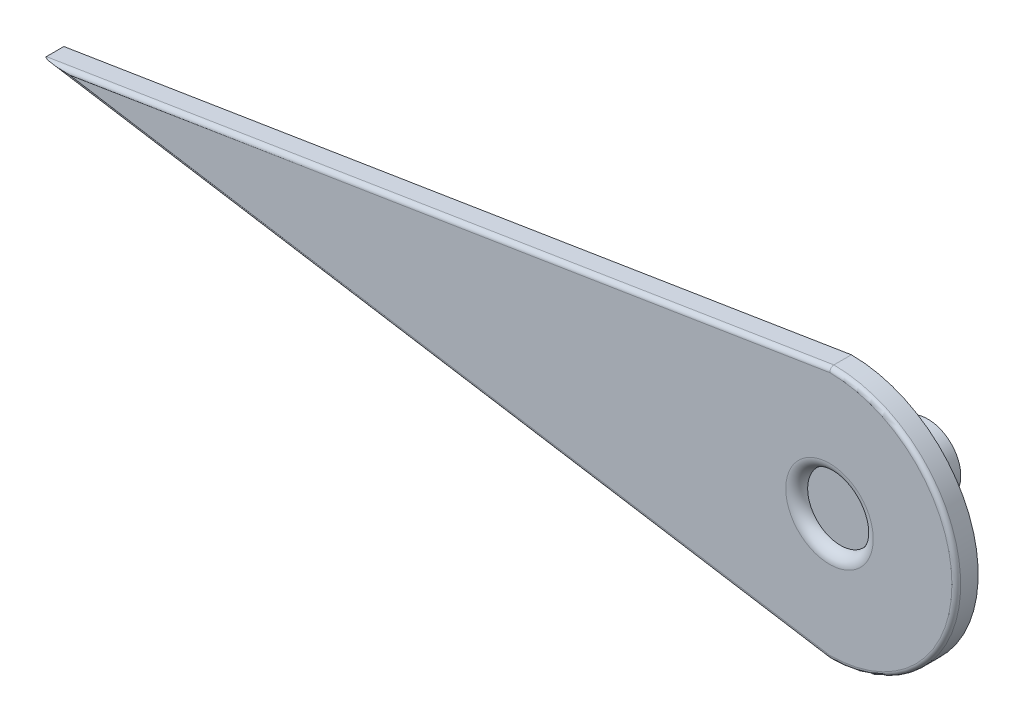
ISO-10303-21;
HEADER;
FILE_DESCRIPTION(('STEP AP214'),'2;1');
FILE_NAME('part.step','',(''),(''),'','','');
FILE_SCHEMA(('AUTOMOTIVE_DESIGN { 1 0 10303 214 1 1 1 1 }'));
ENDSEC;
DATA;
#1=APPLICATION_CONTEXT('core data for automotive mechanical design processes');
#2=APPLICATION_PROTOCOL_DEFINITION('international standard','automotive_design',2000,#1);
#3=PRODUCT_CONTEXT('',#1,'mechanical');
#4=PRODUCT('Part','Part','',(#3));
#5=PRODUCT_RELATED_PRODUCT_CATEGORY('part','',(#4));
#6=PRODUCT_DEFINITION_FORMATION('','',#4);
#7=PRODUCT_DEFINITION_CONTEXT('part definition',#1,'design');
#8=PRODUCT_DEFINITION('design','',#6,#7);
#9=PRODUCT_DEFINITION_SHAPE('','',#8);
#10=(LENGTH_UNIT() NAMED_UNIT(*) SI_UNIT(.MILLI.,.METRE.));
#11=(NAMED_UNIT(*) PLANE_ANGLE_UNIT() SI_UNIT($,.RADIAN.));
#12=(NAMED_UNIT(*) SI_UNIT($,.STERADIAN.) SOLID_ANGLE_UNIT());
#13=UNCERTAINTY_MEASURE_WITH_UNIT(LENGTH_MEASURE(1.E-05),#10,'distance_accuracy_value','');
#14=(GEOMETRIC_REPRESENTATION_CONTEXT(3) GLOBAL_UNCERTAINTY_ASSIGNED_CONTEXT((#13)) GLOBAL_UNIT_ASSIGNED_CONTEXT((#10,
#11,#12)) REPRESENTATION_CONTEXT('',''));
#15=CARTESIAN_POINT('',(0.,0.,0.));
#16=DIRECTION('',(0.,0.,1.));
#17=DIRECTION('',(1.,0.,0.));
#18=AXIS2_PLACEMENT_3D('',#15,#16,#17);
#19=CARTESIAN_POINT('',(3.6,0.,0.05));
#20=DIRECTION('',(0.,0.,-1.));
#21=DIRECTION('',(-1.,0.,0.));
#22=AXIS2_PLACEMENT_3D('',#19,#20,#21);
#23=CYLINDRICAL_SURFACE('',#22,0.15);
#24=CARTESIAN_POINT('',(3.6,0.,0.05));
#25=DIRECTION('',(0.,0.,-1.));
#26=DIRECTION('',(-1.,0.,0.));
#27=AXIS2_PLACEMENT_3D('',#24,#25,#26);
#28=CIRCLE('',#27,0.15);
#29=CARTESIAN_POINT('',(3.45,0.,0.05));
#30=VERTEX_POINT('',#29);
#31=EDGE_CURVE('E11',#30,#30,#28,.T.);
#32=ORIENTED_EDGE('',*,*,#31,.T.);
#33=EDGE_LOOP('',(#32));
#34=FACE_BOUND('',#33,.T.);
#35=CARTESIAN_POINT('',(3.6,0.,-0.35));
#36=DIRECTION('',(0.,0.,-1.));
#37=DIRECTION('',(-1.,0.,0.));
#38=AXIS2_PLACEMENT_3D('',#35,#36,#37);
#39=CIRCLE('',#38,0.15);
#40=CARTESIAN_POINT('',(3.45,0.,-0.35));
#41=VERTEX_POINT('',#40);
#42=EDGE_CURVE('E46',#41,#41,#39,.T.);
#43=ORIENTED_EDGE('',*,*,#42,.F.);
#44=EDGE_LOOP('',(#43));
#45=FACE_BOUND('',#44,.T.);
#46=ADVANCED_FACE('F40',(#34,#45),#23,.T.);
#47=CARTESIAN_POINT('',(3.6,0.,0.05));
#48=DIRECTION('',(0.,0.,-1.));
#49=DIRECTION('',(-1.,0.,0.));
#50=AXIS2_PLACEMENT_3D('',#47,#48,#49);
#51=PLANE('',#50);
#52=ORIENTED_EDGE('',*,*,#31,.F.);
#53=EDGE_LOOP('',(#52));
#54=FACE_BOUND('',#53,.T.);
#55=ADVANCED_FACE('F55',(#54),#51,.F.);
#56=CARTESIAN_POINT('',(3.6,0.,-0.35));
#57=DIRECTION('',(0.,0.,-1.));
#58=DIRECTION('',(-1.,0.,0.));
#59=AXIS2_PLACEMENT_3D('',#56,#57,#58);
#60=PLANE('',#59);
#61=ORIENTED_EDGE('',*,*,#42,.T.);
#62=EDGE_LOOP('',(#61));
#63=FACE_BOUND('',#62,.T.);
#64=ADVANCED_FACE('F52',(#63),#60,.T.);
#65=CLOSED_SHELL('',(#46,#55,#64));
#66=MANIFOLD_SOLID_BREP('B2',#65);
#67=CARTESIAN_POINT('',(3.6,0.,0.1));
#68=DIRECTION('',(0.,0.,-1.));
#69=DIRECTION('',(-1.,0.,0.));
#70=AXIS2_PLACEMENT_3D('',#67,#68,#69);
#71=PLANE('',#70);
#72=DIRECTION('',(0.987286688424679,-0.158949661400808,0.));
#73=VECTOR('',#72,1.);
#74=CARTESIAN_POINT('',(3.51222501173406,-0.545198251621765,0.1));
#75=LINE('',#74,#73);
#76=CARTESIAN_POINT('',(0.125825999399696,0.,0.1));
#77=VERTEX_POINT('',#76);
#78=CARTESIAN_POINT('',(3.60158570999257,-0.559585007664625,0.1));
#79=VERTEX_POINT('',#78);
#80=EDGE_CURVE('E161',#77,#79,#75,.T.);
#81=ORIENTED_EDGE('',*,*,#80,.T.);
#82=CARTESIAN_POINT('',(3.6,0.,0.1));
#83=DIRECTION('',(0.,0.,-1.));
#84=DIRECTION('',(-1.,0.,0.));
#85=AXIS2_PLACEMENT_3D('',#82,#83,#84);
#86=CIRCLE('',#85,0.559587254393092);
#87=CARTESIAN_POINT('',(3.60158570999257,0.559585007664625,0.1));
#88=VERTEX_POINT('',#87);
#89=EDGE_CURVE('E165',#79,#88,#86,.F.);
#90=ORIENTED_EDGE('',*,*,#89,.T.);
#91=DIRECTION('',(-0.987286688424679,-0.158949661400808,0.));
#92=VECTOR('',#91,1.);
#93=CARTESIAN_POINT('',(3.51222501173406,0.545198251621764,0.1));
#94=LINE('',#93,#92);
#95=EDGE_CURVE('E163',#88,#77,#94,.T.);
#96=ORIENTED_EDGE('',*,*,#95,.T.);
#97=EDGE_LOOP('',(#81,#90,#96));
#98=FACE_BOUND('',#97,.T.);
#99=CARTESIAN_POINT('',(3.6,0.,0.1));
#100=DIRECTION('',(0.,0.,-1.));
#101=DIRECTION('',(-1.,0.,0.));
#102=AXIS2_PLACEMENT_3D('',#99,#100,#101);
#103=CIRCLE('',#102,0.2);
#104=CARTESIAN_POINT('',(3.4,0.,0.1));
#105=VERTEX_POINT('',#104);
#106=EDGE_CURVE('E158',#105,#105,#103,.T.);
#107=ORIENTED_EDGE('',*,*,#106,.T.);
#108=EDGE_LOOP('',(#107));
#109=FACE_BOUND('',#108,.T.);
#110=ADVANCED_FACE('F80',(#98,#109),#71,.F.);
#111=CARTESIAN_POINT('',(3.6,0.,0.));
#112=DIRECTION('',(0.,0.,-1.));
#113=DIRECTION('',(-1.,0.,0.));
#114=AXIS2_PLACEMENT_3D('',#111,#112,#113);
#115=PLANE('',#114);
#116=DIRECTION('',(0.987286688424679,-0.158949661400808,0.));
#117=VECTOR('',#116,1.);
#118=CARTESIAN_POINT('',(0.,0.,0.));
#119=LINE('',#118,#117);
#120=CARTESIAN_POINT('',(0.,0.,0.));
#121=VERTEX_POINT('',#120);
#122=CARTESIAN_POINT('',(3.6,-0.579587254393092,0.));
#123=VERTEX_POINT('',#122);
#124=EDGE_CURVE('E142',#121,#123,#119,.T.);
#125=ORIENTED_EDGE('',*,*,#124,.F.);
#126=DIRECTION('',(-0.987286688424679,-0.158949661400808,0.));
#127=VECTOR('',#126,1.);
#128=CARTESIAN_POINT('',(0.,0.,0.));
#129=LINE('',#128,#127);
#130=CARTESIAN_POINT('',(3.6,0.579587254393092,0.));
#131=VERTEX_POINT('',#130);
#132=EDGE_CURVE('E144',#131,#121,#129,.T.);
#133=ORIENTED_EDGE('',*,*,#132,.F.);
#134=CARTESIAN_POINT('',(3.6,0.,0.));
#135=DIRECTION('',(0.,0.,1.));
#136=DIRECTION('',(-1.,0.,0.));
#137=AXIS2_PLACEMENT_3D('',#134,#135,#136);
#138=CIRCLE('',#137,0.579587254393092);
#139=EDGE_CURVE('E131',#123,#131,#138,.T.);
#140=ORIENTED_EDGE('',*,*,#139,.F.);
#141=EDGE_LOOP('',(#125,#133,#140));
#142=FACE_BOUND('',#141,.T.);
#143=CARTESIAN_POINT('',(3.6,0.,0.));
#144=DIRECTION('',(0.,0.,1.));
#145=DIRECTION('',(1.,0.,0.));
#146=AXIS2_PLACEMENT_3D('',#143,#144,#145);
#147=CIRCLE('',#146,0.15);
#148=CARTESIAN_POINT('',(3.75,0.,0.));
#149=VERTEX_POINT('',#148);
#150=EDGE_CURVE('E148',#149,#149,#147,.T.);
#151=ORIENTED_EDGE('',*,*,#150,.T.);
#152=EDGE_LOOP('',(#151));
#153=FACE_BOUND('',#152,.T.);
#154=ADVANCED_FACE('F140',(#142,#153),#115,.T.);
#155=CARTESIAN_POINT('',(0.,0.,0.1));
#156=DIRECTION('',(0.158949661400808,0.987286688424679,0.));
#157=DIRECTION('',(-0.987286688424679,0.158949661400808,0.));
#158=AXIS2_PLACEMENT_3D('',#155,#156,#157);
#159=PLANE('',#158);
#160=DIRECTION('',(0.,0.,-1.));
#161=VECTOR('',#160,1.);
#162=CARTESIAN_POINT('',(3.6,-0.579587254393092,0.1));
#163=LINE('',#162,#161);
#164=CARTESIAN_POINT('',(3.6,-0.579587254393092,0.08));
#165=VERTEX_POINT('',#164);
#166=EDGE_CURVE('E127',#165,#123,#163,.T.);
#167=ORIENTED_EDGE('',*,*,#166,.F.);
#168=DIRECTION('',(0.987286688424679,-0.158949661400808,0.));
#169=VECTOR('',#168,1.);
#170=CARTESIAN_POINT('',(0.,0.,0.08));
#171=LINE('',#170,#169);
#172=CARTESIAN_POINT('',(0.,0.,0.08));
#173=VERTEX_POINT('',#172);
#174=EDGE_CURVE('E38',#165,#173,#171,.F.);
#175=ORIENTED_EDGE('',*,*,#174,.T.);
#176=DIRECTION('',(0.,0.,-1.));
#177=VECTOR('',#176,1.);
#178=CARTESIAN_POINT('',(0.,0.,0.1));
#179=LINE('',#178,#177);
#180=EDGE_CURVE('E147',#173,#121,#179,.T.);
#181=ORIENTED_EDGE('',*,*,#180,.T.);
#182=ORIENTED_EDGE('',*,*,#124,.T.);
#183=EDGE_LOOP('',(#167,#175,#181,#182));
#184=FACE_BOUND('',#183,.T.);
#185=ADVANCED_FACE('F146',(#184),#159,.F.);
#186=CARTESIAN_POINT('',(3.6,0.,0.1));
#187=DIRECTION('',(0.,0.,-1.));
#188=DIRECTION('',(-1.,0.,0.));
#189=AXIS2_PLACEMENT_3D('',#186,#187,#188);
#190=CYLINDRICAL_SURFACE('',#189,0.579587254393092);
#191=DIRECTION('',(0.,0.,-1.));
#192=VECTOR('',#191,1.);
#193=CARTESIAN_POINT('',(3.6,0.579587254393092,0.1));
#194=LINE('',#193,#192);
#195=CARTESIAN_POINT('',(3.6,0.579587254393092,0.08));
#196=VERTEX_POINT('',#195);
#197=EDGE_CURVE('E136',#196,#131,#194,.T.);
#198=ORIENTED_EDGE('',*,*,#197,.F.);
#199=CARTESIAN_POINT('',(3.6,0.,0.08));
#200=DIRECTION('',(0.,0.,-1.));
#201=DIRECTION('',(-1.,0.,0.));
#202=AXIS2_PLACEMENT_3D('',#199,#200,#201);
#203=CIRCLE('',#202,0.579587254393092);
#204=EDGE_CURVE('E133',#196,#165,#203,.T.);
#205=ORIENTED_EDGE('',*,*,#204,.T.);
#206=ORIENTED_EDGE('',*,*,#166,.T.);
#207=ORIENTED_EDGE('',*,*,#139,.T.);
#208=EDGE_LOOP('',(#198,#205,#206,#207));
#209=FACE_BOUND('',#208,.T.);
#210=ADVANCED_FACE('F130',(#209),#190,.T.);
#211=CARTESIAN_POINT('',(0.,0.,0.1));
#212=DIRECTION('',(0.158949661400808,-0.987286688424679,0.));
#213=DIRECTION('',(0.987286688424679,0.158949661400808,0.));
#214=AXIS2_PLACEMENT_3D('',#211,#212,#213);
#215=PLANE('',#214);
#216=ORIENTED_EDGE('',*,*,#180,.F.);
#217=DIRECTION('',(-0.987286688424679,-0.158949661400808,0.));
#218=VECTOR('',#217,1.);
#219=CARTESIAN_POINT('',(0.,0.,0.08));
#220=LINE('',#219,#218);
#221=EDGE_CURVE('E90',#173,#196,#220,.F.);
#222=ORIENTED_EDGE('',*,*,#221,.T.);
#223=ORIENTED_EDGE('',*,*,#197,.T.);
#224=ORIENTED_EDGE('',*,*,#132,.T.);
#225=EDGE_LOOP('',(#216,#222,#223,#224));
#226=FACE_BOUND('',#225,.T.);
#227=ADVANCED_FACE('F203',(#226),#215,.F.);
#228=CARTESIAN_POINT('',(3.6,0.,0.1));
#229=DIRECTION('',(0.,0.,-1.));
#230=DIRECTION('',(-1.,0.,0.));
#231=AXIS2_PLACEMENT_3D('',#228,#229,#230);
#232=CYLINDRICAL_SURFACE('',#231,0.15);
#233=CARTESIAN_POINT('',(3.6,0.,0.05));
#234=DIRECTION('',(0.,0.,-1.));
#235=DIRECTION('',(-1.,0.,0.));
#236=AXIS2_PLACEMENT_3D('',#233,#234,#235);
#237=CIRCLE('',#236,0.15);
#238=CARTESIAN_POINT('',(3.45,0.,0.05));
#239=VERTEX_POINT('',#238);
#240=EDGE_CURVE('E135',#239,#239,#237,.F.);
#241=ORIENTED_EDGE('',*,*,#240,.T.);
#242=EDGE_LOOP('',(#241));
#243=FACE_BOUND('',#242,.T.);
#244=ORIENTED_EDGE('',*,*,#150,.F.);
#245=EDGE_LOOP('',(#244));
#246=FACE_BOUND('',#245,.T.);
#247=ADVANCED_FACE('F201',(#243,#246),#232,.F.);
#248=CARTESIAN_POINT('',(3.6,0.,0.05));
#249=DIRECTION('',(0.,0.,-1.));
#250=DIRECTION('',(-1.,0.,0.));
#251=AXIS2_PLACEMENT_3D('',#248,#249,#250);
#252=TOROIDAL_SURFACE('',#251,0.2,0.05);
#253=ORIENTED_EDGE('',*,*,#106,.F.);
#254=EDGE_LOOP('',(#253));
#255=FACE_BOUND('',#254,.T.);
#256=ORIENTED_EDGE('',*,*,#240,.F.);
#257=EDGE_LOOP('',(#256));
#258=FACE_BOUND('',#257,.T.);
#259=ADVANCED_FACE('F189',(#255,#258),#252,.T.);
#260=CARTESIAN_POINT('',(3.51222501173406,-0.545198251621765,0.08));
#261=DIRECTION('',(0.987286688424679,-0.158949661400808,0.));
#262=DIRECTION('',(0.158949661400808,0.987286688424679,0.));
#263=AXIS2_PLACEMENT_3D('',#260,#261,#262);
#264=CYLINDRICAL_SURFACE('',#263,0.02);
#265=CARTESIAN_POINT('',(3.6,-0.579587254393092,0.08));
#266=CARTESIAN_POINT('',(3.59999991893262,-0.579588221332111,0.0811225040902252));
#267=CARTESIAN_POINT('',(3.60000755376721,-0.579492811747897,0.0822447019825385));
#268=CARTESIAN_POINT('',(3.60003765648513,-0.579116381234014,0.084456464334727));
#269=CARTESIAN_POINT('',(3.60006011280451,-0.5788355050082,0.0855460535441482));
#270=CARTESIAN_POINT('',(3.60011927505944,-0.578095092170998,0.087662911084586));
#271=CARTESIAN_POINT('',(3.60015598754844,-0.577635473392956,0.0886901505024238));
#272=CARTESIAN_POINT('',(3.60024251778896,-0.576551264595827,0.0906525222534182));
#273=CARTESIAN_POINT('',(3.60029233203681,-0.57592671868156,0.0915876791196416));
#274=CARTESIAN_POINT('',(3.60040365891642,-0.574529522505636,0.093341020278524));
#275=CARTESIAN_POINT('',(3.60046518614427,-0.573756687444349,0.0941590563690776));
#276=CARTESIAN_POINT('',(3.60059811426591,-0.57208497792133,0.0956543038461624));
#277=CARTESIAN_POINT('',(3.600669520806,-0.57118603137915,0.0963314341428609));
#278=CARTESIAN_POINT('',(3.60082035745402,-0.569284553632913,0.0975276224282646));
#279=CARTESIAN_POINT('',(3.60089981607041,-0.568281654073932,0.0980460906552257));
#280=CARTESIAN_POINT('',(3.60106410547887,-0.566204987624899,0.0989063995631173));
#281=CARTESIAN_POINT('',(3.60114892611339,-0.56513135457522,0.0992485635983872));
#282=CARTESIAN_POINT('',(3.60129338134321,-0.56330005841303,0.0996666458919217));
#283=CARTESIAN_POINT('',(3.60135221548027,-0.562553448564906,0.0997929917276275));
#284=CARTESIAN_POINT('',(3.60146929088422,-0.561066201318219,0.0999588562819506));
#285=CARTESIAN_POINT('',(3.60152751958248,-0.560325755212105,0.100000101743234));
#286=CARTESIAN_POINT('',(3.60158570999257,-0.559585007664624,0.1));
#287=B_SPLINE_CURVE_WITH_KNOTS('',3,(#265,#266,#267,#268,#269,#270,#271,#272,#273,#274,#275,
#276,#277,#278,#279,#280,#281,#282,#283,#284,#285,#286),.UNSPECIFIED.,.F.,.F.,(4,2,2,2,2,2,2,2,
2,2,4),(0.,0.00336299637199757,0.00672337197917453,0.0100852941560761,0.0134463181964854,
0.0168115583116931,0.0201787297644498,0.0235582693963714,0.0269315884513337,0.0292055741934764,
0.0314329464697098),.UNSPECIFIED.);
#288=EDGE_CURVE('E104',#79,#165,#287,.F.);
#289=ORIENTED_EDGE('',*,*,#288,.F.);
#290=ORIENTED_EDGE('',*,*,#80,.F.);
#291=CARTESIAN_POINT('',(0.125825999399697,0.,0.08));
#292=DIRECTION('',(0.,-1.,0.));
#293=DIRECTION('',(1.,0.,0.));
#294=AXIS2_PLACEMENT_3D('',#291,#292,#293);
#295=ELLIPSE('',#294,0.125825999399697,0.02);
#296=EDGE_CURVE('E85',#173,#77,#295,.F.);
#297=ORIENTED_EDGE('',*,*,#296,.F.);
#298=ORIENTED_EDGE('',*,*,#174,.F.);
#299=EDGE_LOOP('',(#289,#290,#297,#298));
#300=FACE_BOUND('',#299,.T.);
#301=ADVANCED_FACE('F82',(#300),#264,.T.);
#302=CARTESIAN_POINT('',(3.51222501173406,0.545198251621764,0.08));
#303=DIRECTION('',(-0.987286688424679,-0.158949661400808,0.));
#304=DIRECTION('',(0.158949661400808,-0.987286688424679,0.));
#305=AXIS2_PLACEMENT_3D('',#302,#303,#304);
#306=CYLINDRICAL_SURFACE('',#305,0.02);
#307=ORIENTED_EDGE('',*,*,#296,.T.);
#308=ORIENTED_EDGE('',*,*,#95,.F.);
#309=CARTESIAN_POINT('',(3.6,0.579587254393092,0.08));
#310=CARTESIAN_POINT('',(3.59999991893262,0.579588221332111,0.0811225040902252));
#311=CARTESIAN_POINT('',(3.60000755376721,0.579492811747897,0.0822447019825385));
#312=CARTESIAN_POINT('',(3.60003765648513,0.579116381234014,0.084456464334727));
#313=CARTESIAN_POINT('',(3.60006011280451,0.5788355050082,0.0855460535441482));
#314=CARTESIAN_POINT('',(3.60011927505944,0.578095092170998,0.087662911084586));
#315=CARTESIAN_POINT('',(3.60015598754844,0.577635473392956,0.0886901505024238));
#316=CARTESIAN_POINT('',(3.60024251778897,0.576551264595827,0.0906525222534182));
#317=CARTESIAN_POINT('',(3.60029233203681,0.57592671868156,0.0915876791196417));
#318=CARTESIAN_POINT('',(3.60040365891642,0.574529522505636,0.093341020278524));
#319=CARTESIAN_POINT('',(3.60046518614427,0.573756687444349,0.0941590563690775));
#320=CARTESIAN_POINT('',(3.60059811426591,0.57208497792133,0.0956543038461623));
#321=CARTESIAN_POINT('',(3.600669520806,0.57118603137915,0.0963314341428609));
#322=CARTESIAN_POINT('',(3.60082035745402,0.569284553632913,0.0975276224282646));
#323=CARTESIAN_POINT('',(3.60089981607041,0.568281654073931,0.0980460906552257));
#324=CARTESIAN_POINT('',(3.60106410547887,0.566204987624899,0.0989063995631173));
#325=CARTESIAN_POINT('',(3.60114892611339,0.56513135457522,0.0992485635983872));
#326=CARTESIAN_POINT('',(3.60129338134321,0.56330005841303,0.0996666458919218));
#327=CARTESIAN_POINT('',(3.60135221548027,0.562553448564906,0.0997929917276275));
#328=CARTESIAN_POINT('',(3.60146929088422,0.561066201318219,0.0999588562819506));
#329=CARTESIAN_POINT('',(3.60152751958248,0.560325755212105,0.100000101743234));
#330=CARTESIAN_POINT('',(3.60158570999257,0.559585007664624,0.1));
#331=B_SPLINE_CURVE_WITH_KNOTS('',3,(#309,#310,#311,#312,#313,#314,#315,#316,#317,#318,#319,
#320,#321,#322,#323,#324,#325,#326,#327,#328,#329,#330),.UNSPECIFIED.,.F.,.F.,(4,2,2,2,2,2,2,2,
2,2,4),(0.,0.00336299637199756,0.00672337197917453,0.0100852941560761,0.0134463181964854,
0.0168115583116931,0.0201787297644498,0.0235582693963715,0.0269315884513337,0.0292055741934767,
0.0314329464697098),.UNSPECIFIED.);
#332=EDGE_CURVE('E170',#196,#88,#331,.T.);
#333=ORIENTED_EDGE('',*,*,#332,.F.);
#334=ORIENTED_EDGE('',*,*,#221,.F.);
#335=EDGE_LOOP('',(#307,#308,#333,#334));
#336=FACE_BOUND('',#335,.T.);
#337=ADVANCED_FACE('F181',(#336),#306,.T.);
#338=CARTESIAN_POINT('',(3.6,0.,0.08));
#339=DIRECTION('',(0.,0.,-1.));
#340=DIRECTION('',(-1.,0.,0.));
#341=AXIS2_PLACEMENT_3D('',#338,#339,#340);
#342=TOROIDAL_SURFACE('',#341,0.559587254393092,0.02);
#343=ORIENTED_EDGE('',*,*,#288,.T.);
#344=ORIENTED_EDGE('',*,*,#204,.F.);
#345=ORIENTED_EDGE('',*,*,#332,.T.);
#346=ORIENTED_EDGE('',*,*,#89,.F.);
#347=EDGE_LOOP('',(#343,#344,#345,#346));
#348=FACE_BOUND('',#347,.T.);
#349=ADVANCED_FACE('F178',(#348),#342,.T.);
#350=CLOSED_SHELL('',(#110,#154,#185,#210,#227,#247,#259,#301,#337,#349));
#351=MANIFOLD_SOLID_BREP('B6',#350);
#352=ADVANCED_BREP_SHAPE_REPRESENTATION('',(#18,#66,#351),#14);
#353=SHAPE_DEFINITION_REPRESENTATION(#9,#352);
ENDSEC;
END-ISO-10303-21;
